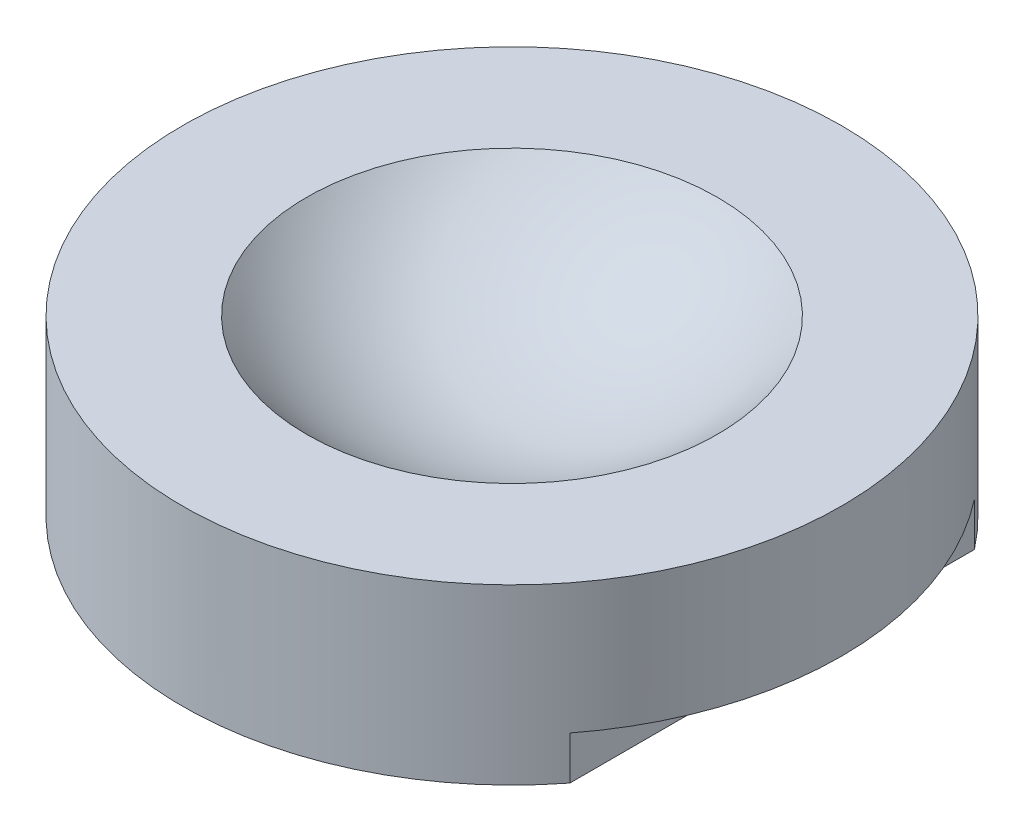
ISO-10303-21;
HEADER;
FILE_DESCRIPTION(('STEP AP214'),'2;1');
FILE_NAME('part.step','',(''),(''),'','','');
FILE_SCHEMA(('AUTOMOTIVE_DESIGN { 1 0 10303 214 1 1 1 1 }'));
ENDSEC;
DATA;
#1=APPLICATION_CONTEXT('core data for automotive mechanical design processes');
#2=APPLICATION_PROTOCOL_DEFINITION('international standard','automotive_design',2000,#1);
#3=PRODUCT_CONTEXT('',#1,'mechanical');
#4=PRODUCT('Part','Part','',(#3));
#5=PRODUCT_RELATED_PRODUCT_CATEGORY('part','',(#4));
#6=PRODUCT_DEFINITION_FORMATION('','',#4);
#7=PRODUCT_DEFINITION_CONTEXT('part definition',#1,'design');
#8=PRODUCT_DEFINITION('design','',#6,#7);
#9=PRODUCT_DEFINITION_SHAPE('','',#8);
#10=(LENGTH_UNIT() NAMED_UNIT(*) SI_UNIT(.MILLI.,.METRE.));
#11=(NAMED_UNIT(*) PLANE_ANGLE_UNIT() SI_UNIT($,.RADIAN.));
#12=(NAMED_UNIT(*) SI_UNIT($,.STERADIAN.) SOLID_ANGLE_UNIT());
#13=UNCERTAINTY_MEASURE_WITH_UNIT(LENGTH_MEASURE(1.E-05),#10,'distance_accuracy_value','');
#14=(GEOMETRIC_REPRESENTATION_CONTEXT(3) GLOBAL_UNCERTAINTY_ASSIGNED_CONTEXT((#13)) GLOBAL_UNIT_ASSIGNED_CONTEXT((#10,
#11,#12)) REPRESENTATION_CONTEXT('',''));
#15=CARTESIAN_POINT('',(0.,0.,0.));
#16=DIRECTION('',(0.,0.,1.));
#17=DIRECTION('',(1.,0.,0.));
#18=AXIS2_PLACEMENT_3D('',#15,#16,#17);
#19=CARTESIAN_POINT('',(-26.2916512459885,69.5,0.));
#20=DIRECTION('',(0.,-1.,0.));
#21=DIRECTION('',(0.,0.,1.));
#22=AXIS2_PLACEMENT_3D('',#19,#20,#21);
#23=CYLINDRICAL_SURFACE('',#22,3.8);
#24=CARTESIAN_POINT('',(-26.2916512459885,69.,0.));
#25=DIRECTION('',(0.,-1.,0.));
#26=DIRECTION('',(0.,0.,-1.));
#27=AXIS2_PLACEMENT_3D('',#24,#25,#26);
#28=CIRCLE('',#27,3.8);
#29=CARTESIAN_POINT('',(-23.2916512459885,69.,2.33238075793812));
#30=VERTEX_POINT('',#29);
#31=CARTESIAN_POINT('',(-23.2916512459885,69.,-2.33238075793812));
#32=VERTEX_POINT('',#31);
#33=EDGE_CURVE('E80',#30,#32,#28,.T.);
#34=ORIENTED_EDGE('',*,*,#33,.F.);
#35=DIRECTION('',(0.,-1.,0.));
#36=VECTOR('',#35,1.);
#37=CARTESIAN_POINT('',(-23.2916512459885,69.5,2.33238075793812));
#38=LINE('',#37,#36);
#39=CARTESIAN_POINT('',(-23.2916512459885,69.5,2.33238075793812));
#40=VERTEX_POINT('',#39);
#41=EDGE_CURVE('E49',#40,#30,#38,.T.);
#42=ORIENTED_EDGE('',*,*,#41,.F.);
#43=CARTESIAN_POINT('',(-26.2916512459885,69.5,0.));
#44=DIRECTION('',(0.,-1.,0.));
#45=DIRECTION('',(0.,0.,-1.));
#46=AXIS2_PLACEMENT_3D('',#43,#44,#45);
#47=CIRCLE('',#46,3.8);
#48=CARTESIAN_POINT('',(-23.2916512459885,69.5,-2.33238075793812));
#49=VERTEX_POINT('',#48);
#50=EDGE_CURVE('E72',#49,#40,#47,.T.);
#51=ORIENTED_EDGE('',*,*,#50,.F.);
#52=DIRECTION('',(0.,-1.,0.));
#53=VECTOR('',#52,1.);
#54=CARTESIAN_POINT('',(-23.2916512459885,69.5,-2.33238075793812));
#55=LINE('',#54,#53);
#56=EDGE_CURVE('E11',#49,#32,#55,.T.);
#57=ORIENTED_EDGE('',*,*,#56,.T.);
#58=EDGE_LOOP('',(#34,#42,#51,#57));
#59=FACE_BOUND('',#58,.T.);
#60=CARTESIAN_POINT('',(-26.2916512459885,71.,0.));
#61=DIRECTION('',(0.,-1.,0.));
#62=DIRECTION('',(0.,0.,-1.));
#63=AXIS2_PLACEMENT_3D('',#60,#61,#62);
#64=CIRCLE('',#63,3.8);
#65=CARTESIAN_POINT('',(-26.2916512459885,71.,-3.8));
#66=VERTEX_POINT('',#65);
#67=EDGE_CURVE('E74',#66,#66,#64,.T.);
#68=ORIENTED_EDGE('',*,*,#67,.T.);
#69=EDGE_LOOP('',(#68));
#70=FACE_BOUND('',#69,.T.);
#71=ADVANCED_FACE('F41',(#59,#70),#23,.T.);
#72=CARTESIAN_POINT('',(-23.2916512459885,69.5,-2.33238075793812));
#73=DIRECTION('',(-1.,0.,0.));
#74=DIRECTION('',(0.,0.,1.));
#75=AXIS2_PLACEMENT_3D('',#72,#73,#74);
#76=PLANE('',#75);
#77=DIRECTION('',(0.,0.,1.));
#78=VECTOR('',#77,1.);
#79=CARTESIAN_POINT('',(-23.2916512459885,69.,-2.33238075793812));
#80=LINE('',#79,#78);
#81=EDGE_CURVE('E63',#32,#30,#80,.T.);
#82=ORIENTED_EDGE('',*,*,#81,.F.);
#83=ORIENTED_EDGE('',*,*,#56,.F.);
#84=DIRECTION('',(0.,0.,1.));
#85=VECTOR('',#84,1.);
#86=CARTESIAN_POINT('',(-23.2916512459885,69.5,-2.33238075793812));
#87=LINE('',#86,#85);
#88=EDGE_CURVE('E57',#49,#40,#87,.T.);
#89=ORIENTED_EDGE('',*,*,#88,.T.);
#90=ORIENTED_EDGE('',*,*,#41,.T.);
#91=EDGE_LOOP('',(#82,#83,#89,#90));
#92=FACE_BOUND('',#91,.T.);
#93=ADVANCED_FACE('F66',(#92),#76,.F.);
#94=CARTESIAN_POINT('',(-26.2916512459885,69.,0.));
#95=DIRECTION('',(0.,1.,0.));
#96=DIRECTION('',(0.,0.,-1.));
#97=AXIS2_PLACEMENT_3D('',#94,#95,#96);
#98=PLANE('',#97);
#99=ORIENTED_EDGE('',*,*,#33,.T.);
#100=ORIENTED_EDGE('',*,*,#81,.T.);
#101=EDGE_LOOP('',(#99,#100));
#102=FACE_BOUND('',#101,.T.);
#103=ADVANCED_FACE('F100',(#102),#98,.F.);
#104=CARTESIAN_POINT('',(-26.2916512459885,69.5,0.));
#105=DIRECTION('',(0.,1.,0.));
#106=DIRECTION('',(0.,0.,-1.));
#107=AXIS2_PLACEMENT_3D('',#104,#105,#106);
#108=PLANE('',#107);
#109=ORIENTED_EDGE('',*,*,#50,.T.);
#110=ORIENTED_EDGE('',*,*,#88,.F.);
#111=EDGE_LOOP('',(#109,#110));
#112=FACE_BOUND('',#111,.T.);
#113=ADVANCED_FACE('F75',(#112),#108,.F.);
#114=CARTESIAN_POINT('',(-26.2916512459885,71.,0.));
#115=DIRECTION('',(0.,1.,0.));
#116=DIRECTION('',(0.,0.,-1.));
#117=AXIS2_PLACEMENT_3D('',#114,#115,#116);
#118=PLANE('',#117);
#119=CARTESIAN_POINT('',(-26.2916512459885,71.,0.));
#120=DIRECTION('',(0.,-1.,0.));
#121=DIRECTION('',(0.,0.,-1.));
#122=AXIS2_PLACEMENT_3D('',#119,#120,#121);
#123=CIRCLE('',#122,2.36854385646541);
#124=CARTESIAN_POINT('',(-26.2916512459885,71.,-2.36854385646541));
#125=VERTEX_POINT('',#124);
#126=EDGE_CURVE('E42',#125,#125,#123,.T.);
#127=ORIENTED_EDGE('',*,*,#126,.T.);
#128=EDGE_LOOP('',(#127));
#129=FACE_BOUND('',#128,.T.);
#130=ORIENTED_EDGE('',*,*,#67,.F.);
#131=EDGE_LOOP('',(#130));
#132=FACE_BOUND('',#131,.T.);
#133=ADVANCED_FACE('F88',(#129,#132),#118,.T.);
#134=CARTESIAN_POINT('',(-26.2916512459885,73.,0.));
#135=DIRECTION('',(0.,0.,-1.));
#136=DIRECTION('',(-1.,0.,0.));
#137=AXIS2_PLACEMENT_3D('',#134,#135,#136);
#138=SPHERICAL_SURFACE('',#137,3.1);
#139=CARTESIAN_POINT('',(-26.2916512459885,73.,0.));
#140=DIRECTION('',(0.,-1.,0.));
#141=DIRECTION('',(0.,0.,-1.));
#142=AXIS2_PLACEMENT_3D('',#139,#140,#141);
#143=SPHERICAL_SURFACE('',#142,3.1);
#144=ORIENTED_EDGE('',*,*,#126,.F.);
#145=EDGE_LOOP('',(#144));
#146=FACE_BOUND('',#145,.T.);
#147=ADVANCED_FACE('F86',(#146),#143,.F.);
#148=CLOSED_SHELL('',(#71,#93,#103,#113,#133,#147));
#149=MANIFOLD_SOLID_BREP('B2',#148);
#150=ADVANCED_BREP_SHAPE_REPRESENTATION('',(#18,#149),#14);
#151=SHAPE_DEFINITION_REPRESENTATION(#9,#150);
ENDSEC;
END-ISO-10303-21;
